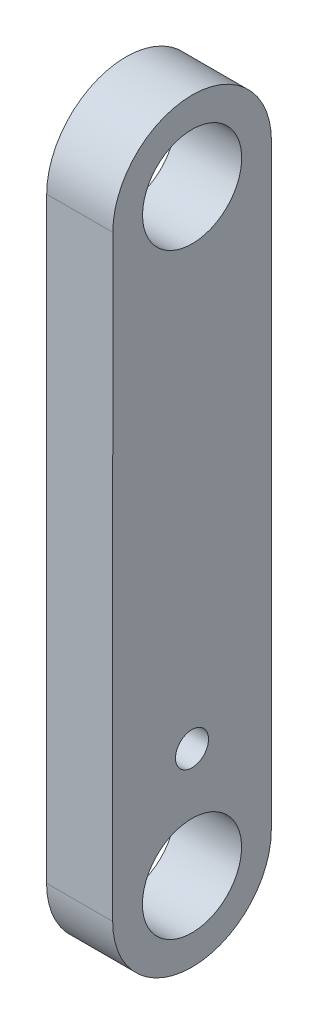
ISO-10303-21;
HEADER;
FILE_DESCRIPTION(('STEP AP214'),'2;1');
FILE_NAME('part.step','',(''),(''),'','','');
FILE_SCHEMA(('AUTOMOTIVE_DESIGN { 1 0 10303 214 1 1 1 1 }'));
ENDSEC;
DATA;
#1=APPLICATION_CONTEXT('core data for automotive mechanical design processes');
#2=APPLICATION_PROTOCOL_DEFINITION('international standard','automotive_design',2000,#1);
#3=PRODUCT_CONTEXT('',#1,'mechanical');
#4=PRODUCT('Part','Part','',(#3));
#5=PRODUCT_RELATED_PRODUCT_CATEGORY('part','',(#4));
#6=PRODUCT_DEFINITION_FORMATION('','',#4);
#7=PRODUCT_DEFINITION_CONTEXT('part definition',#1,'design');
#8=PRODUCT_DEFINITION('design','',#6,#7);
#9=PRODUCT_DEFINITION_SHAPE('','',#8);
#10=(LENGTH_UNIT() NAMED_UNIT(*) SI_UNIT(.MILLI.,.METRE.));
#11=(NAMED_UNIT(*) PLANE_ANGLE_UNIT() SI_UNIT($,.RADIAN.));
#12=(NAMED_UNIT(*) SI_UNIT($,.STERADIAN.) SOLID_ANGLE_UNIT());
#13=UNCERTAINTY_MEASURE_WITH_UNIT(LENGTH_MEASURE(1.E-05),#10,'distance_accuracy_value','');
#14=(GEOMETRIC_REPRESENTATION_CONTEXT(3) GLOBAL_UNCERTAINTY_ASSIGNED_CONTEXT((#13)) GLOBAL_UNIT_ASSIGNED_CONTEXT((#10,
#11,#12)) REPRESENTATION_CONTEXT('',''));
#15=CARTESIAN_POINT('',(0.,0.,0.));
#16=DIRECTION('',(0.,0.,1.));
#17=DIRECTION('',(1.,0.,0.));
#18=AXIS2_PLACEMENT_3D('',#15,#16,#17);
#19=CARTESIAN_POINT('',(-49.7913443309954,902.806737308248,-1.79412040779425E-09));
#20=DIRECTION('',(0.999999973291694,-0.000231120339369198,0.));
#21=DIRECTION('',(0.000222778984922406,0.963909016317614,0.266231776148405));
#22=AXIS2_PLACEMENT_3D('',#19,#20,#21);
#23=PLANE('',#22);
#24=CARTESIAN_POINT('',(-49.9615465286816,166.384345384969,0.));
#25=DIRECTION('',(0.999999973291694,-0.000231120339369198,0.));
#26=DIRECTION('',(0.000231120339369198,0.999999973291694,0.));
#27=AXIS2_PLACEMENT_3D('',#24,#25,#26);
#28=CIRCLE('',#27,25.);
#29=CARTESIAN_POINT('',(-49.9557685201974,191.384344717261,0.));
#30=VERTEX_POINT('',#29);
#31=EDGE_CURVE('E149',#30,#30,#28,.T.);
#32=ORIENTED_EDGE('',*,*,#31,.T.);
#33=EDGE_LOOP('',(#32));
#34=FACE_BOUND('',#33,.T.);
#35=CARTESIAN_POINT('',(-49.9999986652491,0.0115560175499851,-1.79412040779425E-09));
#36=DIRECTION('',(0.999999973291694,-0.000231120339369198,0.));
#37=DIRECTION('',(-0.000222778984922406,-0.963909016317614,-0.266231776148405));
#38=AXIS2_PLACEMENT_3D('',#35,#36,#37);
#39=CIRCLE('',#38,75.0000000000072);
#40=CARTESIAN_POINT('',(-50.0167070891182,-72.281620206278,-19.9673832129264));
#41=VERTEX_POINT('',#40);
#42=EDGE_CURVE('E11',#41,#41,#39,.T.);
#43=ORIENTED_EDGE('',*,*,#42,.T.);
#44=EDGE_LOOP('',(#43));
#45=FACE_BOUND('',#44,.T.);
#46=CARTESIAN_POINT('',(-49.7913443309954,902.806737308248,-1.79412040779425E-09));
#47=DIRECTION('',(0.999999973291694,-0.000231120339369198,0.));
#48=DIRECTION('',(-0.000222778984922406,-0.963909016317614,-0.266231776148405));
#49=AXIS2_PLACEMENT_3D('',#46,#47,#48);
#50=CIRCLE('',#49,75.0000000000001);
#51=CARTESIAN_POINT('',(-49.8080527548646,830.513561084427,-19.9673832129245));
#52=VERTEX_POINT('',#51);
#53=EDGE_CURVE('E114',#52,#52,#50,.T.);
#54=ORIENTED_EDGE('',*,*,#53,.T.);
#55=EDGE_LOOP('',(#54));
#56=FACE_BOUND('',#55,.T.);
#57=CARTESIAN_POINT('',(-49.9999986652491,0.0115560175517615,-1.79412040779425E-09));
#58=DIRECTION('',(0.999999973291694,-0.000231120339369198,0.));
#59=DIRECTION('',(0.000222778984922406,0.963909016317614,0.266231776148405));
#60=AXIS2_PLACEMENT_3D('',#57,#58,#59);
#61=CIRCLE('',#60,120.);
#62=CARTESIAN_POINT('',(-49.999998665249,0.0115560175526497,119.999999998206));
#63=VERTEX_POINT('',#62);
#64=CARTESIAN_POINT('',(-49.999998665249,0.0115560175535379,-120.000000001794));
#65=VERTEX_POINT('',#64);
#66=EDGE_CURVE('E111',#63,#65,#61,.T.);
#67=ORIENTED_EDGE('',*,*,#66,.F.);
#68=DIRECTION('',(-0.000231120339369198,-0.999999973291694,0.));
#69=VECTOR('',#68,1.);
#70=CARTESIAN_POINT('',(-49.7913443309954,902.806737308247,119.999999998205));
#71=LINE('',#70,#69);
#72=CARTESIAN_POINT('',(-49.7913443309954,902.806737308313,119.999999998205));
#73=VERTEX_POINT('',#72);
#74=EDGE_CURVE('E103',#73,#63,#71,.T.);
#75=ORIENTED_EDGE('',*,*,#74,.F.);
#76=CARTESIAN_POINT('',(-49.7913443309954,902.80673730825,-1.7936763185844E-09));
#77=DIRECTION('',(0.999999973291694,-0.000231120339369198,0.));
#78=DIRECTION('',(0.000222778984922406,0.963909016317614,0.266231776148405));
#79=AXIS2_PLACEMENT_3D('',#76,#77,#78);
#80=CIRCLE('',#79,120.);
#81=CARTESIAN_POINT('',(-49.7913443309954,902.80673730825,-120.000000001794));
#82=VERTEX_POINT('',#81);
#83=EDGE_CURVE('E85',#82,#73,#80,.T.);
#84=ORIENTED_EDGE('',*,*,#83,.F.);
#85=DIRECTION('',(-0.000231120339369198,-0.999999973291694,0.));
#86=VECTOR('',#85,1.);
#87=CARTESIAN_POINT('',(-49.7913443309955,902.806737308248,-120.000000001794));
#88=LINE('',#87,#86);
#89=EDGE_CURVE('E108',#82,#65,#88,.T.);
#90=ORIENTED_EDGE('',*,*,#89,.T.);
#91=EDGE_LOOP('',(#67,#75,#84,#90));
#92=FACE_BOUND('',#91,.T.);
#93=ADVANCED_FACE('F36',(#34,#45,#56,#92),#23,.F.);
#94=CARTESIAN_POINT('',(50.2086529981746,902.783625274312,-1.79412040779425E-09));
#95=DIRECTION('',(0.999999973291694,-0.000231120339369198,0.));
#96=DIRECTION('',(0.000222778984922406,0.963909016317614,0.266231776148405));
#97=AXIS2_PLACEMENT_3D('',#94,#95,#96);
#98=PLANE('',#97);
#99=CARTESIAN_POINT('',(50.0384508004884,166.361233351032,0.));
#100=DIRECTION('',(0.999999973291694,-0.000231120339369198,0.));
#101=DIRECTION('',(0.000231120339369198,0.999999973291694,0.));
#102=AXIS2_PLACEMENT_3D('',#99,#100,#101);
#103=CIRCLE('',#102,25.);
#104=CARTESIAN_POINT('',(50.0442288089727,191.361232683325,0.));
#105=VERTEX_POINT('',#104);
#106=EDGE_CURVE('E40',#105,#105,#103,.T.);
#107=ORIENTED_EDGE('',*,*,#106,.F.);
#108=EDGE_LOOP('',(#107));
#109=FACE_BOUND('',#108,.T.);
#110=CARTESIAN_POINT('',(49.999998663921,-0.0115560163873596,-1.79412040779425E-09));
#111=DIRECTION('',(0.999999973291694,-0.000231120339369198,0.));
#112=DIRECTION('',(-0.000222778984922406,-0.963909016317614,-0.266231776148405));
#113=AXIS2_PLACEMENT_3D('',#110,#111,#112);
#114=CIRCLE('',#113,75.0000000000072);
#115=CARTESIAN_POINT('',(49.9832902400518,-72.3047322402154,-19.9673832129264));
#116=VERTEX_POINT('',#115);
#117=EDGE_CURVE('E45',#116,#116,#114,.T.);
#118=ORIENTED_EDGE('',*,*,#117,.F.);
#119=EDGE_LOOP('',(#118));
#120=FACE_BOUND('',#119,.T.);
#121=CARTESIAN_POINT('',(50.2086529981746,902.783625274312,-1.79412040779425E-09));
#122=DIRECTION('',(0.999999973291694,-0.000231120339369198,0.));
#123=DIRECTION('',(-0.000222778984922406,-0.963909016317614,-0.266231776148405));
#124=AXIS2_PLACEMENT_3D('',#121,#122,#123);
#125=CIRCLE('',#124,75.0000000000001);
#126=CARTESIAN_POINT('',(50.1919445743054,830.490449050491,-19.9673832129245));
#127=VERTEX_POINT('',#126);
#128=EDGE_CURVE('E113',#127,#127,#125,.T.);
#129=ORIENTED_EDGE('',*,*,#128,.F.);
#130=EDGE_LOOP('',(#129));
#131=FACE_BOUND('',#130,.T.);
#132=DIRECTION('',(-0.000231120339369177,-0.999999973291694,0.));
#133=VECTOR('',#132,1.);
#134=CARTESIAN_POINT('',(48.5782725929846,-6151.46510980121,119.999999998206));
#135=LINE('',#134,#133);
#136=CARTESIAN_POINT('',(50.2086529981746,902.783625274312,119.999999998206));
#137=VERTEX_POINT('',#136);
#138=CARTESIAN_POINT('',(49.9999986639211,-0.0115560163855832,119.999999998206));
#139=VERTEX_POINT('',#138);
#140=EDGE_CURVE('E91',#137,#139,#135,.T.);
#141=ORIENTED_EDGE('',*,*,#140,.T.);
#142=CARTESIAN_POINT('',(49.9999986639211,-0.0115560163864714,-1.79412040779425E-09));
#143=DIRECTION('',(0.999999973291694,-0.000231120339369177,0.));
#144=DIRECTION('',(0.000222778984922379,0.963909016317614,0.266231776148405));
#145=AXIS2_PLACEMENT_3D('',#142,#143,#144);
#146=CIRCLE('',#145,120.);
#147=CARTESIAN_POINT('',(49.9999986639211,-0.0115560163855832,-120.000000001794));
#148=VERTEX_POINT('',#147);
#149=EDGE_CURVE('E61',#139,#148,#146,.T.);
#150=ORIENTED_EDGE('',*,*,#149,.T.);
#151=DIRECTION('',(-0.000231120339369177,-0.999999973291694,0.));
#152=VECTOR('',#151,1.);
#153=CARTESIAN_POINT('',(48.5782725929847,-6151.46510980121,-120.000000001795));
#154=LINE('',#153,#152);
#155=CARTESIAN_POINT('',(50.2086529981746,902.783625274313,-120.000000001794));
#156=VERTEX_POINT('',#155);
#157=EDGE_CURVE('E96',#156,#148,#154,.T.);
#158=ORIENTED_EDGE('',*,*,#157,.F.);
#159=CARTESIAN_POINT('',(50.2086529981747,902.783625274313,-1.7936763185844E-09));
#160=DIRECTION('',(0.999999973291694,-0.000231120339369177,0.));
#161=DIRECTION('',(0.000222778984922379,0.963909016317614,0.266231776148405));
#162=AXIS2_PLACEMENT_3D('',#159,#160,#161);
#163=CIRCLE('',#162,120.);
#164=EDGE_CURVE('E82',#156,#137,#163,.T.);
#165=ORIENTED_EDGE('',*,*,#164,.T.);
#166=EDGE_LOOP('',(#141,#150,#158,#165));
#167=FACE_BOUND('',#166,.T.);
#168=ADVANCED_FACE('F38',(#109,#120,#131,#167),#98,.T.);
#169=CARTESIAN_POINT('',(-49.9999986652491,0.0115560175499851,-1.79412040779425E-09));
#170=DIRECTION('',(0.999999973291694,-0.000231120339369198,0.));
#171=DIRECTION('',(0.000222778984922406,0.963909016317614,0.266231776148405));
#172=AXIS2_PLACEMENT_3D('',#169,#170,#171);
#173=CYLINDRICAL_SURFACE('',#172,75.0000000000072);
#174=ORIENTED_EDGE('',*,*,#42,.F.);
#175=EDGE_LOOP('',(#174));
#176=FACE_BOUND('',#175,.T.);
#177=ORIENTED_EDGE('',*,*,#117,.T.);
#178=EDGE_LOOP('',(#177));
#179=FACE_BOUND('',#178,.T.);
#180=ADVANCED_FACE('F121',(#176,#179),#173,.F.);
#181=CARTESIAN_POINT('',(-49.7913443309954,902.806737308248,-1.79412040779425E-09));
#182=DIRECTION('',(0.999999973291694,-0.000231120339369198,0.));
#183=DIRECTION('',(0.000222778984922406,0.963909016317614,0.266231776148405));
#184=AXIS2_PLACEMENT_3D('',#181,#182,#183);
#185=CYLINDRICAL_SURFACE('',#184,75.0000000000001);
#186=ORIENTED_EDGE('',*,*,#53,.F.);
#187=EDGE_LOOP('',(#186));
#188=FACE_BOUND('',#187,.T.);
#189=ORIENTED_EDGE('',*,*,#128,.T.);
#190=EDGE_LOOP('',(#189));
#191=FACE_BOUND('',#190,.T.);
#192=ADVANCED_FACE('F128',(#188,#191),#185,.F.);
#193=CARTESIAN_POINT('',(-134.999996395043,0.0312012463972167,-1.79412040779425E-09));
#194=DIRECTION('',(0.999999973291694,-0.000231120339369198,0.));
#195=DIRECTION('',(0.000222778984922406,0.963909016317614,0.266231776148405));
#196=AXIS2_PLACEMENT_3D('',#193,#194,#195);
#197=CYLINDRICAL_SURFACE('',#196,120.);
#198=ORIENTED_EDGE('',*,*,#66,.T.);
#199=DIRECTION('',(0.999999973291694,-0.000231120339369198,0.));
#200=VECTOR('',#199,1.);
#201=CARTESIAN_POINT('',(-134.999996395042,0.031201246398993,-120.000000001794));
#202=LINE('',#201,#200);
#203=EDGE_CURVE('E101',#65,#148,#202,.T.);
#204=ORIENTED_EDGE('',*,*,#203,.T.);
#205=ORIENTED_EDGE('',*,*,#149,.F.);
#206=DIRECTION('',(0.999999973291694,-0.000231120339369198,0.));
#207=VECTOR('',#206,1.);
#208=CARTESIAN_POINT('',(-134.999996395042,0.0312012463981048,119.999999998206));
#209=LINE('',#208,#207);
#210=EDGE_CURVE('E88',#63,#139,#209,.T.);
#211=ORIENTED_EDGE('',*,*,#210,.F.);
#212=EDGE_LOOP('',(#198,#204,#205,#211));
#213=FACE_BOUND('',#212,.T.);
#214=ADVANCED_FACE('F130',(#213),#197,.T.);
#215=CARTESIAN_POINT('',(-136.421722465979,-6151.42235253843,-120.000000001795));
#216=DIRECTION('',(0.,0.,1.));
#217=DIRECTION('',(-8.34135421229301E-06,-0.999999999965211,0.));
#218=AXIS2_PLACEMENT_3D('',#215,#216,#217);
#219=PLANE('',#218);
#220=DIRECTION('',(0.999999973291694,-0.000231120339369198,0.));
#221=VECTOR('',#220,1.);
#222=CARTESIAN_POINT('',(-134.791342060789,902.826382537096,-120.000000001794));
#223=LINE('',#222,#221);
#224=EDGE_CURVE('E87',#82,#156,#223,.T.);
#225=ORIENTED_EDGE('',*,*,#224,.T.);
#226=ORIENTED_EDGE('',*,*,#157,.T.);
#227=ORIENTED_EDGE('',*,*,#203,.F.);
#228=ORIENTED_EDGE('',*,*,#89,.F.);
#229=EDGE_LOOP('',(#225,#226,#227,#228));
#230=FACE_BOUND('',#229,.T.);
#231=ADVANCED_FACE('F137',(#230),#219,.F.);
#232=CARTESIAN_POINT('',(-134.791342060789,902.826382537096,-1.79412040779425E-09));
#233=DIRECTION('',(0.999999973291694,-0.000231120339369198,0.));
#234=DIRECTION('',(0.000222778984922406,0.963909016317614,0.266231776148405));
#235=AXIS2_PLACEMENT_3D('',#232,#233,#234);
#236=CYLINDRICAL_SURFACE('',#235,120.);
#237=ORIENTED_EDGE('',*,*,#83,.T.);
#238=DIRECTION('',(0.999999973291694,-0.000231120339369198,0.));
#239=VECTOR('',#238,1.);
#240=CARTESIAN_POINT('',(-134.791342060789,902.826382537096,119.999999998206));
#241=LINE('',#240,#239);
#242=EDGE_CURVE('E53',#73,#137,#241,.T.);
#243=ORIENTED_EDGE('',*,*,#242,.T.);
#244=ORIENTED_EDGE('',*,*,#164,.F.);
#245=ORIENTED_EDGE('',*,*,#224,.F.);
#246=EDGE_LOOP('',(#237,#243,#244,#245));
#247=FACE_BOUND('',#246,.T.);
#248=ADVANCED_FACE('F79',(#247),#236,.T.);
#249=CARTESIAN_POINT('',(-136.421722465979,-6151.42235253843,119.999999998205));
#250=DIRECTION('',(0.,0.,1.));
#251=DIRECTION('',(-8.34135421229302E-06,-0.999999999965211,0.));
#252=AXIS2_PLACEMENT_3D('',#249,#250,#251);
#253=PLANE('',#252);
#254=ORIENTED_EDGE('',*,*,#74,.T.);
#255=ORIENTED_EDGE('',*,*,#210,.T.);
#256=ORIENTED_EDGE('',*,*,#140,.F.);
#257=ORIENTED_EDGE('',*,*,#242,.F.);
#258=EDGE_LOOP('',(#254,#255,#256,#257));
#259=FACE_BOUND('',#258,.T.);
#260=ADVANCED_FACE('F92',(#259),#253,.T.);
#261=CARTESIAN_POINT('',(50.3025740020821,166.361172306787,0.));
#262=DIRECTION('',(-0.999999973291694,0.000231120339369198,0.));
#263=DIRECTION('',(-0.000231120339369198,-0.999999973291694,0.));
#264=AXIS2_PLACEMENT_3D('',#261,#262,#263);
#265=CYLINDRICAL_SURFACE('',#264,25.);
#266=ORIENTED_EDGE('',*,*,#106,.T.);
#267=EDGE_LOOP('',(#266));
#268=FACE_BOUND('',#267,.T.);
#269=ORIENTED_EDGE('',*,*,#31,.F.);
#270=EDGE_LOOP('',(#269));
#271=FACE_BOUND('',#270,.T.);
#272=ADVANCED_FACE('F160',(#268,#271),#265,.F.);
#273=CLOSED_SHELL('',(#93,#168,#180,#192,#214,#231,#248,#260,#272));
#274=MANIFOLD_SOLID_BREP('B2',#273);
#275=ADVANCED_BREP_SHAPE_REPRESENTATION('',(#18,#274),#14);
#276=SHAPE_DEFINITION_REPRESENTATION(#9,#275);
ENDSEC;
END-ISO-10303-21;
